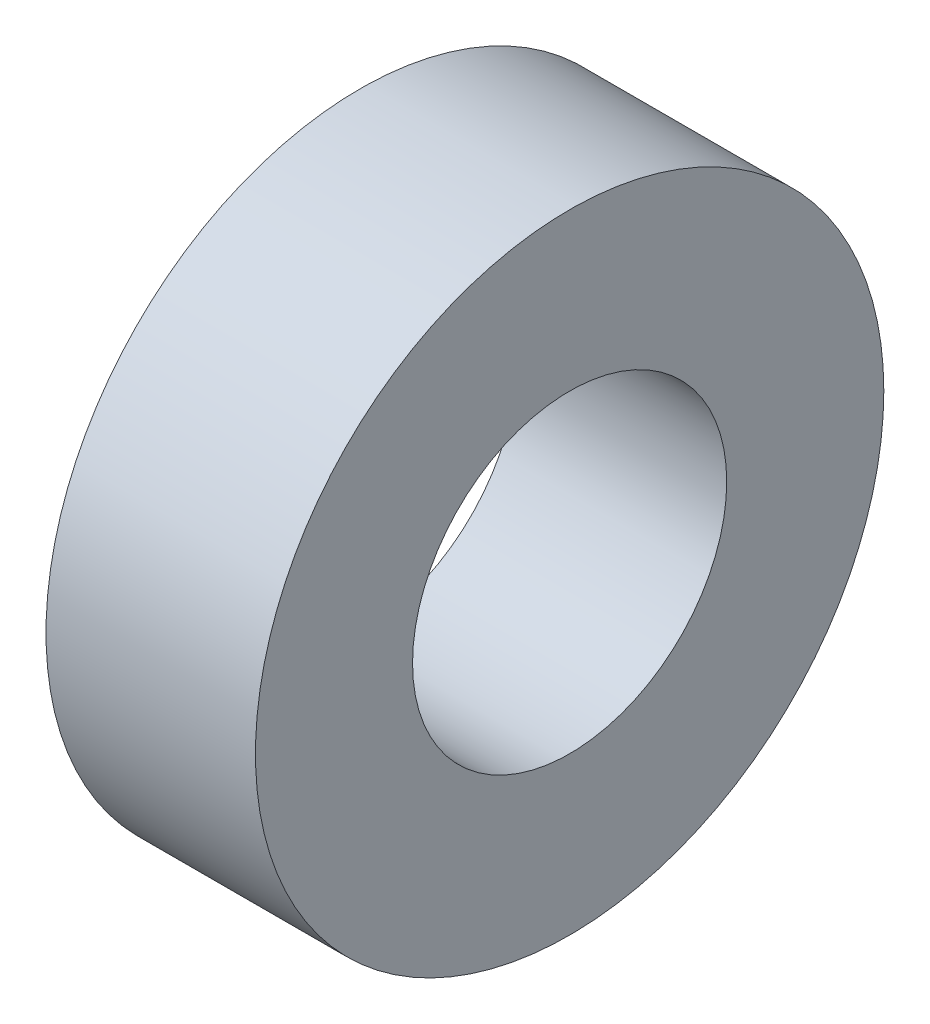
ISO-10303-21;
HEADER;
FILE_DESCRIPTION(('STEP AP214'),'2;1');
FILE_NAME('part.step','',(''),(''),'','','');
FILE_SCHEMA(('AUTOMOTIVE_DESIGN { 1 0 10303 214 1 1 1 1 }'));
ENDSEC;
DATA;
#1=APPLICATION_CONTEXT('core data for automotive mechanical design processes');
#2=APPLICATION_PROTOCOL_DEFINITION('international standard','automotive_design',2000,#1);
#3=PRODUCT_CONTEXT('',#1,'mechanical');
#4=PRODUCT('Part','Part','',(#3));
#5=PRODUCT_RELATED_PRODUCT_CATEGORY('part','',(#4));
#6=PRODUCT_DEFINITION_FORMATION('','',#4);
#7=PRODUCT_DEFINITION_CONTEXT('part definition',#1,'design');
#8=PRODUCT_DEFINITION('design','',#6,#7);
#9=PRODUCT_DEFINITION_SHAPE('','',#8);
#10=(LENGTH_UNIT() NAMED_UNIT(*) SI_UNIT(.MILLI.,.METRE.));
#11=(NAMED_UNIT(*) PLANE_ANGLE_UNIT() SI_UNIT($,.RADIAN.));
#12=(NAMED_UNIT(*) SI_UNIT($,.STERADIAN.) SOLID_ANGLE_UNIT());
#13=UNCERTAINTY_MEASURE_WITH_UNIT(LENGTH_MEASURE(1.E-05),#10,'distance_accuracy_value','');
#14=(GEOMETRIC_REPRESENTATION_CONTEXT(3) GLOBAL_UNCERTAINTY_ASSIGNED_CONTEXT((#13)) GLOBAL_UNIT_ASSIGNED_CONTEXT((#10,
#11,#12)) REPRESENTATION_CONTEXT('',''));
#15=CARTESIAN_POINT('',(0.,0.,0.));
#16=DIRECTION('',(0.,0.,1.));
#17=DIRECTION('',(1.,0.,0.));
#18=AXIS2_PLACEMENT_3D('',#15,#16,#17);
#19=CARTESIAN_POINT('',(2.,0.,0.));
#20=DIRECTION('',(1.,0.,0.));
#21=DIRECTION('',(0.,0.,-1.));
#22=AXIS2_PLACEMENT_3D('',#19,#20,#21);
#23=PLANE('',#22);
#24=CARTESIAN_POINT('',(2.,0.,0.));
#25=DIRECTION('',(1.,0.,0.));
#26=DIRECTION('',(0.,0.,-1.));
#27=AXIS2_PLACEMENT_3D('',#24,#25,#26);
#28=CIRCLE('',#27,3.);
#29=CARTESIAN_POINT('',(2.,0.,-3.));
#30=VERTEX_POINT('',#29);
#31=EDGE_CURVE('E10',#30,#30,#28,.T.);
#32=ORIENTED_EDGE('',*,*,#31,.T.);
#33=EDGE_LOOP('',(#32));
#34=FACE_BOUND('',#33,.T.);
#35=CARTESIAN_POINT('',(2.,0.,0.));
#36=DIRECTION('',(1.,0.,0.));
#37=DIRECTION('',(0.,0.,-1.));
#38=AXIS2_PLACEMENT_3D('',#35,#36,#37);
#39=CIRCLE('',#38,1.5);
#40=CARTESIAN_POINT('',(2.,0.,-1.5));
#41=VERTEX_POINT('',#40);
#42=EDGE_CURVE('E42',#41,#41,#39,.T.);
#43=ORIENTED_EDGE('',*,*,#42,.F.);
#44=EDGE_LOOP('',(#43));
#45=FACE_BOUND('',#44,.T.);
#46=ADVANCED_FACE('F31',(#34,#45),#23,.T.);
#47=CARTESIAN_POINT('',(0.,0.,0.));
#48=DIRECTION('',(1.,0.,0.));
#49=DIRECTION('',(0.,0.,-1.));
#50=AXIS2_PLACEMENT_3D('',#47,#48,#49);
#51=PLANE('',#50);
#52=CARTESIAN_POINT('',(0.,0.,0.));
#53=DIRECTION('',(1.,0.,0.));
#54=DIRECTION('',(0.,0.,-1.));
#55=AXIS2_PLACEMENT_3D('',#52,#53,#54);
#56=CIRCLE('',#55,3.);
#57=CARTESIAN_POINT('',(0.,0.,-3.));
#58=VERTEX_POINT('',#57);
#59=EDGE_CURVE('E35',#58,#58,#56,.T.);
#60=ORIENTED_EDGE('',*,*,#59,.F.);
#61=EDGE_LOOP('',(#60));
#62=FACE_BOUND('',#61,.T.);
#63=CARTESIAN_POINT('',(0.,0.,0.));
#64=DIRECTION('',(1.,0.,0.));
#65=DIRECTION('',(0.,0.,-1.));
#66=AXIS2_PLACEMENT_3D('',#63,#64,#65);
#67=CIRCLE('',#66,1.5);
#68=CARTESIAN_POINT('',(0.,0.,-1.5));
#69=VERTEX_POINT('',#68);
#70=EDGE_CURVE('E44',#69,#69,#67,.T.);
#71=ORIENTED_EDGE('',*,*,#70,.T.);
#72=EDGE_LOOP('',(#71));
#73=FACE_BOUND('',#72,.T.);
#74=ADVANCED_FACE('F54',(#62,#73),#51,.F.);
#75=CARTESIAN_POINT('',(2.,0.,0.));
#76=DIRECTION('',(-1.,0.,0.));
#77=DIRECTION('',(0.,0.,1.));
#78=AXIS2_PLACEMENT_3D('',#75,#76,#77);
#79=CYLINDRICAL_SURFACE('',#78,3.);
#80=ORIENTED_EDGE('',*,*,#31,.F.);
#81=EDGE_LOOP('',(#80));
#82=FACE_BOUND('',#81,.T.);
#83=ORIENTED_EDGE('',*,*,#59,.T.);
#84=EDGE_LOOP('',(#83));
#85=FACE_BOUND('',#84,.T.);
#86=ADVANCED_FACE('F33',(#82,#85),#79,.T.);
#87=CARTESIAN_POINT('',(2.,0.,0.));
#88=DIRECTION('',(-1.,0.,0.));
#89=DIRECTION('',(0.,0.,1.));
#90=AXIS2_PLACEMENT_3D('',#87,#88,#89);
#91=CYLINDRICAL_SURFACE('',#90,1.5);
#92=ORIENTED_EDGE('',*,*,#42,.T.);
#93=EDGE_LOOP('',(#92));
#94=FACE_BOUND('',#93,.T.);
#95=ORIENTED_EDGE('',*,*,#70,.F.);
#96=EDGE_LOOP('',(#95));
#97=FACE_BOUND('',#96,.T.);
#98=ADVANCED_FACE('F50',(#94,#97),#91,.F.);
#99=CLOSED_SHELL('',(#46,#74,#86,#98));
#100=MANIFOLD_SOLID_BREP('B2',#99);
#101=ADVANCED_BREP_SHAPE_REPRESENTATION('',(#18,#100),#14);
#102=SHAPE_DEFINITION_REPRESENTATION(#9,#101);
ENDSEC;
END-ISO-10303-21;
